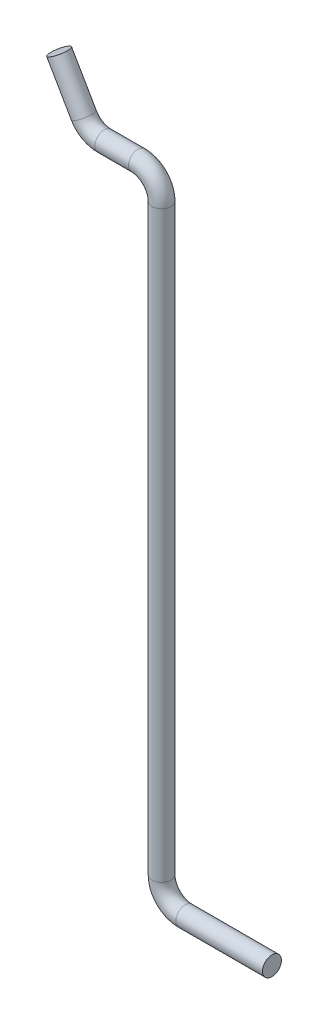
ISO-10303-21;
HEADER;
FILE_DESCRIPTION(('STEP AP214'),'2;1');
FILE_NAME('part.step','',(''),(''),'','','');
FILE_SCHEMA(('AUTOMOTIVE_DESIGN { 1 0 10303 214 1 1 1 1 }'));
ENDSEC;
DATA;
#1=APPLICATION_CONTEXT('core data for automotive mechanical design processes');
#2=APPLICATION_PROTOCOL_DEFINITION('international standard','automotive_design',2000,#1);
#3=PRODUCT_CONTEXT('',#1,'mechanical');
#4=PRODUCT('Part','Part','',(#3));
#5=PRODUCT_RELATED_PRODUCT_CATEGORY('part','',(#4));
#6=PRODUCT_DEFINITION_FORMATION('','',#4);
#7=PRODUCT_DEFINITION_CONTEXT('part definition',#1,'design');
#8=PRODUCT_DEFINITION('design','',#6,#7);
#9=PRODUCT_DEFINITION_SHAPE('','',#8);
#10=(LENGTH_UNIT() NAMED_UNIT(*) SI_UNIT(.MILLI.,.METRE.));
#11=(NAMED_UNIT(*) PLANE_ANGLE_UNIT() SI_UNIT($,.RADIAN.));
#12=(NAMED_UNIT(*) SI_UNIT($,.STERADIAN.) SOLID_ANGLE_UNIT());
#13=UNCERTAINTY_MEASURE_WITH_UNIT(LENGTH_MEASURE(1.E-05),#10,'distance_accuracy_value','');
#14=(GEOMETRIC_REPRESENTATION_CONTEXT(3) GLOBAL_UNCERTAINTY_ASSIGNED_CONTEXT((#13)) GLOBAL_UNIT_ASSIGNED_CONTEXT((#10,
#11,#12)) REPRESENTATION_CONTEXT('',''));
#15=CARTESIAN_POINT('',(0.,0.,0.));
#16=DIRECTION('',(0.,0.,1.));
#17=DIRECTION('',(1.,0.,0.));
#18=AXIS2_PLACEMENT_3D('',#15,#16,#17);
#19=CARTESIAN_POINT('',(-2.00000000000001,3.46410161513775,0.));
#20=DIRECTION('',(-0.500000000000001,0.866025403784438,0.));
#21=DIRECTION('',(0.,0.,1.));
#22=AXIS2_PLACEMENT_3D('',#19,#20,#21);
#23=PLANE('',#22);
#24=CARTESIAN_POINT('',(-2.00000000000001,3.46410161513775,0.));
#25=DIRECTION('',(-0.500000000000001,0.866025403784438,0.));
#26=DIRECTION('',(0.,0.,1.));
#27=AXIS2_PLACEMENT_3D('',#24,#25,#26);
#28=CIRCLE('',#27,0.6);
#29=CARTESIAN_POINT('',(-2.00000000000001,3.46410161513775,0.6));
#30=VERTEX_POINT('',#29);
#31=EDGE_CURVE('E90',#30,#30,#28,.T.);
#32=ORIENTED_EDGE('',*,*,#31,.T.);
#33=EDGE_LOOP('',(#32));
#34=FACE_BOUND('',#33,.T.);
#35=ADVANCED_FACE('F55',(#34),#23,.T.);
#36=CARTESIAN_POINT('',(11.5,-40.,0.));
#37=DIRECTION('',(-1.,0.,0.));
#38=DIRECTION('',(0.,0.,1.));
#39=AXIS2_PLACEMENT_3D('',#36,#37,#38);
#40=PLANE('',#39);
#41=CARTESIAN_POINT('',(11.5,-40.,0.));
#42=DIRECTION('',(-1.,0.,0.));
#43=DIRECTION('',(0.,0.,1.));
#44=AXIS2_PLACEMENT_3D('',#41,#42,#43);
#45=CIRCLE('',#44,0.6);
#46=CARTESIAN_POINT('',(11.5,-40.,0.6));
#47=VERTEX_POINT('',#46);
#48=EDGE_CURVE('E11',#47,#47,#45,.T.);
#49=ORIENTED_EDGE('',*,*,#48,.F.);
#50=EDGE_LOOP('',(#49));
#51=FACE_BOUND('',#50,.T.);
#52=ADVANCED_FACE('F99',(#51),#40,.F.);
#53=CARTESIAN_POINT('',(-2.00000000000001,3.46410161513775,0.));
#54=DIRECTION('',(0.500000000000001,-0.866025403784438,0.));
#55=DIRECTION('',(0.866025403784438,0.500000000000001,0.));
#56=AXIS2_PLACEMENT_3D('',#53,#54,#55);
#57=CYLINDRICAL_SURFACE('',#56,0.6);
#58=CARTESIAN_POINT('',(-0.433012701892218,0.749999999999997,0.));
#59=DIRECTION('',(-0.500000000000001,0.866025403784438,0.));
#60=DIRECTION('',(0.,0.,1.));
#61=AXIS2_PLACEMENT_3D('',#58,#59,#60);
#62=CIRCLE('',#61,0.6);
#63=CARTESIAN_POINT('',(-0.95262794416288,0.449999999999996,0.));
#64=VERTEX_POINT('',#63);
#65=EDGE_CURVE('E86',#64,#64,#62,.T.);
#66=ORIENTED_EDGE('',*,*,#65,.T.);
#67=EDGE_LOOP('',(#66));
#68=FACE_BOUND('',#67,.T.);
#69=ORIENTED_EDGE('',*,*,#31,.F.);
#70=EDGE_LOOP('',(#69));
#71=FACE_BOUND('',#70,.T.);
#72=ADVANCED_FACE('F96',(#68,#71),#57,.T.);
#73=CARTESIAN_POINT('',(0.866025403784437,1.5,0.));
#74=DIRECTION('',(0.,0.,1.));
#75=DIRECTION('',(1.,0.,0.));
#76=AXIS2_PLACEMENT_3D('',#73,#74,#75);
#77=TOROIDAL_SURFACE('',#76,1.5,0.6);
#78=CARTESIAN_POINT('',(0.866025403784448,0.,0.));
#79=DIRECTION('',(-1.,0.,0.));
#80=DIRECTION('',(0.,0.,1.));
#81=AXIS2_PLACEMENT_3D('',#78,#79,#80);
#82=CIRCLE('',#81,0.6);
#83=CARTESIAN_POINT('',(0.866025403784452,-0.599999999999999,0.));
#84=VERTEX_POINT('',#83);
#85=EDGE_CURVE('E82',#84,#84,#82,.T.);
#86=CARTESIAN_POINT('',(0.866025403784437,1.5,0.));
#87=DIRECTION('',(0.,0.,1.));
#88=DIRECTION('',(1.,0.,0.));
#89=AXIS2_PLACEMENT_3D('',#86,#87,#88);
#90=CIRCLE('',#89,2.1);
#91=EDGE_CURVE('',#64,#84,#90,.T.);
#92=ORIENTED_EDGE('',*,*,#65,.F.);
#93=ORIENTED_EDGE('',*,*,#85,.T.);
#94=ORIENTED_EDGE('',*,*,#91,.T.);
#95=ORIENTED_EDGE('',*,*,#91,.F.);
#96=EDGE_LOOP('',(#92,#94,#93,#95));
#97=FACE_BOUND('',#96,.T.);
#98=ADVANCED_FACE('F98',(#97),#77,.T.);
#99=CARTESIAN_POINT('',(0.866025403784438,0.,0.));
#100=DIRECTION('',(1.,0.,0.));
#101=DIRECTION('',(0.,0.,-1.));
#102=AXIS2_PLACEMENT_3D('',#99,#100,#101);
#103=CYLINDRICAL_SURFACE('',#102,0.6);
#104=CARTESIAN_POINT('',(3.,0.,0.));
#105=DIRECTION('',(-1.,0.,0.));
#106=DIRECTION('',(0.,0.,1.));
#107=AXIS2_PLACEMENT_3D('',#104,#105,#106);
#108=CIRCLE('',#107,0.6);
#109=CARTESIAN_POINT('',(3.,0.6,0.));
#110=VERTEX_POINT('',#109);
#111=EDGE_CURVE('E78',#110,#110,#108,.T.);
#112=ORIENTED_EDGE('',*,*,#111,.T.);
#113=EDGE_LOOP('',(#112));
#114=FACE_BOUND('',#113,.T.);
#115=ORIENTED_EDGE('',*,*,#85,.F.);
#116=EDGE_LOOP('',(#115));
#117=FACE_BOUND('',#116,.T.);
#118=ADVANCED_FACE('F106',(#114,#117),#103,.T.);
#119=CARTESIAN_POINT('',(3.,-1.5,0.));
#120=DIRECTION('',(0.,0.,-1.));
#121=DIRECTION('',(-1.,0.,0.));
#122=AXIS2_PLACEMENT_3D('',#119,#120,#121);
#123=TOROIDAL_SURFACE('',#122,1.5,0.6);
#124=CARTESIAN_POINT('',(4.5,-1.5,0.));
#125=DIRECTION('',(0.,1.,0.));
#126=DIRECTION('',(0.,0.,1.));
#127=AXIS2_PLACEMENT_3D('',#124,#125,#126);
#128=CIRCLE('',#127,0.6);
#129=CARTESIAN_POINT('',(5.1,-1.5,0.));
#130=VERTEX_POINT('',#129);
#131=EDGE_CURVE('E72',#130,#130,#128,.T.);
#132=CARTESIAN_POINT('',(3.,-1.5,0.));
#133=DIRECTION('',(0.,0.,-1.));
#134=DIRECTION('',(-1.,0.,0.));
#135=AXIS2_PLACEMENT_3D('',#132,#133,#134);
#136=CIRCLE('',#135,2.1);
#137=EDGE_CURVE('',#110,#130,#136,.T.);
#138=ORIENTED_EDGE('',*,*,#111,.F.);
#139=ORIENTED_EDGE('',*,*,#131,.T.);
#140=ORIENTED_EDGE('',*,*,#137,.T.);
#141=ORIENTED_EDGE('',*,*,#137,.F.);
#142=EDGE_LOOP('',(#138,#140,#139,#141));
#143=FACE_BOUND('',#142,.T.);
#144=ADVANCED_FACE('F123',(#143),#123,.T.);
#145=CARTESIAN_POINT('',(4.5,-1.5,0.));
#146=DIRECTION('',(0.,-1.,0.));
#147=DIRECTION('',(1.,0.,0.));
#148=AXIS2_PLACEMENT_3D('',#145,#146,#147);
#149=CYLINDRICAL_SURFACE('',#148,0.6);
#150=CARTESIAN_POINT('',(4.5,-38.5,0.));
#151=DIRECTION('',(0.,1.,0.));
#152=DIRECTION('',(0.,0.,1.));
#153=AXIS2_PLACEMENT_3D('',#150,#151,#152);
#154=CIRCLE('',#153,0.6);
#155=CARTESIAN_POINT('',(3.9,-38.5,0.));
#156=VERTEX_POINT('',#155);
#157=EDGE_CURVE('E67',#156,#156,#154,.T.);
#158=ORIENTED_EDGE('',*,*,#157,.T.);
#159=EDGE_LOOP('',(#158));
#160=FACE_BOUND('',#159,.T.);
#161=ORIENTED_EDGE('',*,*,#131,.F.);
#162=EDGE_LOOP('',(#161));
#163=FACE_BOUND('',#162,.T.);
#164=ADVANCED_FACE('F117',(#160,#163),#149,.T.);
#165=CARTESIAN_POINT('',(6.,-38.5,0.));
#166=DIRECTION('',(0.,0.,1.));
#167=DIRECTION('',(1.,0.,0.));
#168=AXIS2_PLACEMENT_3D('',#165,#166,#167);
#169=TOROIDAL_SURFACE('',#168,1.5,0.6);
#170=CARTESIAN_POINT('',(6.,-40.,0.));
#171=DIRECTION('',(-1.,0.,0.));
#172=DIRECTION('',(0.,0.,1.));
#173=AXIS2_PLACEMENT_3D('',#170,#171,#172);
#174=CIRCLE('',#173,0.6);
#175=CARTESIAN_POINT('',(6.,-40.6,0.));
#176=VERTEX_POINT('',#175);
#177=EDGE_CURVE('E62',#176,#176,#174,.T.);
#178=CARTESIAN_POINT('',(6.,-38.5,0.));
#179=DIRECTION('',(0.,0.,1.));
#180=DIRECTION('',(1.,0.,0.));
#181=AXIS2_PLACEMENT_3D('',#178,#179,#180);
#182=CIRCLE('',#181,2.1);
#183=EDGE_CURVE('',#156,#176,#182,.T.);
#184=ORIENTED_EDGE('',*,*,#157,.F.);
#185=ORIENTED_EDGE('',*,*,#177,.T.);
#186=ORIENTED_EDGE('',*,*,#183,.T.);
#187=ORIENTED_EDGE('',*,*,#183,.F.);
#188=EDGE_LOOP('',(#184,#186,#185,#187));
#189=FACE_BOUND('',#188,.T.);
#190=ADVANCED_FACE('F112',(#189),#169,.T.);
#191=CARTESIAN_POINT('',(6.,-40.,0.));
#192=DIRECTION('',(1.,0.,0.));
#193=DIRECTION('',(0.,0.,-1.));
#194=AXIS2_PLACEMENT_3D('',#191,#192,#193);
#195=CYLINDRICAL_SURFACE('',#194,0.6);
#196=ORIENTED_EDGE('',*,*,#48,.T.);
#197=EDGE_LOOP('',(#196));
#198=FACE_BOUND('',#197,.T.);
#199=ORIENTED_EDGE('',*,*,#177,.F.);
#200=EDGE_LOOP('',(#199));
#201=FACE_BOUND('',#200,.T.);
#202=ADVANCED_FACE('F110',(#198,#201),#195,.T.);
#203=CLOSED_SHELL('',(#35,#52,#72,#98,#118,#144,#164,#190,#202));
#204=MANIFOLD_SOLID_BREP('B2',#203);
#205=ADVANCED_BREP_SHAPE_REPRESENTATION('',(#18,#204),#14);
#206=SHAPE_DEFINITION_REPRESENTATION(#9,#205);
ENDSEC;
END-ISO-10303-21;
